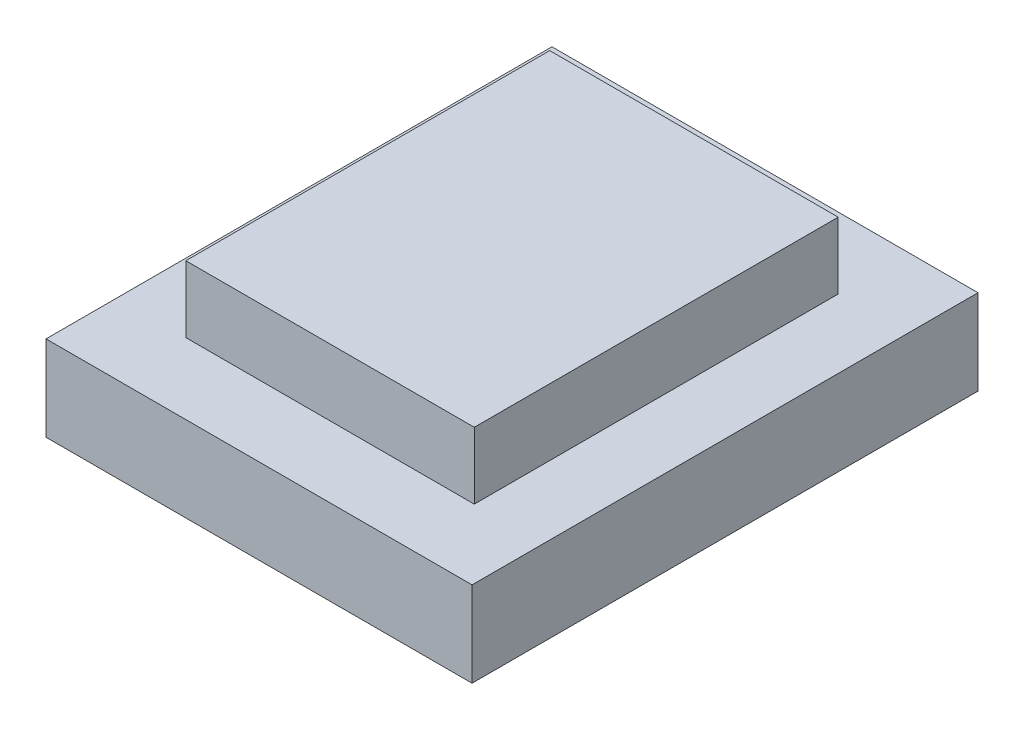
ISO-10303-21;
HEADER;
FILE_DESCRIPTION(('STEP AP214'),'2;1');
FILE_NAME('part.step','',(''),(''),'','','');
FILE_SCHEMA(('AUTOMOTIVE_DESIGN { 1 0 10303 214 1 1 1 1 }'));
ENDSEC;
DATA;
#1=APPLICATION_CONTEXT('core data for automotive mechanical design processes');
#2=APPLICATION_PROTOCOL_DEFINITION('international standard','automotive_design',2000,#1);
#3=PRODUCT_CONTEXT('',#1,'mechanical');
#4=PRODUCT('Part','Part','',(#3));
#5=PRODUCT_RELATED_PRODUCT_CATEGORY('part','',(#4));
#6=PRODUCT_DEFINITION_FORMATION('','',#4);
#7=PRODUCT_DEFINITION_CONTEXT('part definition',#1,'design');
#8=PRODUCT_DEFINITION('design','',#6,#7);
#9=PRODUCT_DEFINITION_SHAPE('','',#8);
#10=(LENGTH_UNIT() NAMED_UNIT(*) SI_UNIT(.MILLI.,.METRE.));
#11=(NAMED_UNIT(*) PLANE_ANGLE_UNIT() SI_UNIT($,.RADIAN.));
#12=(NAMED_UNIT(*) SI_UNIT($,.STERADIAN.) SOLID_ANGLE_UNIT());
#13=UNCERTAINTY_MEASURE_WITH_UNIT(LENGTH_MEASURE(1.E-05),#10,'distance_accuracy_value','');
#14=(GEOMETRIC_REPRESENTATION_CONTEXT(3) GLOBAL_UNCERTAINTY_ASSIGNED_CONTEXT((#13)) GLOBAL_UNIT_ASSIGNED_CONTEXT((#10,
#11,#12)) REPRESENTATION_CONTEXT('',''));
#15=CARTESIAN_POINT('',(0.,0.,0.));
#16=DIRECTION('',(0.,0.,1.));
#17=DIRECTION('',(1.,0.,0.));
#18=AXIS2_PLACEMENT_3D('',#15,#16,#17);
#19=CARTESIAN_POINT('',(0.,8.41,0.));
#20=DIRECTION('',(0.,1.,0.));
#21=DIRECTION('',(0.,0.,1.));
#22=AXIS2_PLACEMENT_3D('',#19,#20,#21);
#23=PLANE('',#22);
#24=DIRECTION('',(1.,0.,0.));
#25=VECTOR('',#24,1.);
#26=CARTESIAN_POINT('',(4.7,8.41,-16.7));
#27=LINE('',#26,#25);
#28=CARTESIAN_POINT('',(4.7,8.41,-16.7));
#29=VERTEX_POINT('',#28);
#30=CARTESIAN_POINT('',(14.3,8.41,-16.7));
#31=VERTEX_POINT('',#30);
#32=EDGE_CURVE('E252',#29,#31,#27,.T.);
#33=ORIENTED_EDGE('',*,*,#32,.F.);
#34=DIRECTION('',(0.,0.,1.));
#35=VECTOR('',#34,1.);
#36=CARTESIAN_POINT('',(4.7,8.41,-16.7));
#37=LINE('',#36,#35);
#38=CARTESIAN_POINT('',(4.7,8.41,-5.3));
#39=VERTEX_POINT('',#38);
#40=EDGE_CURVE('E267',#29,#39,#37,.T.);
#41=ORIENTED_EDGE('',*,*,#40,.T.);
#42=DIRECTION('',(1.,0.,0.));
#43=VECTOR('',#42,1.);
#44=CARTESIAN_POINT('',(4.7,8.41,-5.3));
#45=LINE('',#44,#43);
#46=CARTESIAN_POINT('',(14.3,8.41,-5.3));
#47=VERTEX_POINT('',#46);
#48=EDGE_CURVE('E269',#39,#47,#45,.T.);
#49=ORIENTED_EDGE('',*,*,#48,.T.);
#50=DIRECTION('',(0.,0.,1.));
#51=VECTOR('',#50,1.);
#52=CARTESIAN_POINT('',(14.3,8.41,-16.7));
#53=LINE('',#52,#51);
#54=EDGE_CURVE('E232',#31,#47,#53,.T.);
#55=ORIENTED_EDGE('',*,*,#54,.F.);
#56=EDGE_LOOP('',(#33,#41,#49,#55));
#57=FACE_BOUND('',#56,.T.);
#58=DIRECTION('',(-1.,0.,0.));
#59=VECTOR('',#58,1.);
#60=CARTESIAN_POINT('',(6.25,8.41,-15.1));
#61=LINE('',#60,#59);
#62=CARTESIAN_POINT('',(12.75,8.41,-15.1));
#63=VERTEX_POINT('',#62);
#64=CARTESIAN_POINT('',(6.25,8.41,-15.1));
#65=VERTEX_POINT('',#64);
#66=EDGE_CURVE('E201',#63,#65,#61,.T.);
#67=ORIENTED_EDGE('',*,*,#66,.F.);
#68=DIRECTION('',(0.,0.,-1.));
#69=VECTOR('',#68,1.);
#70=CARTESIAN_POINT('',(12.75,8.41,-15.1));
#71=LINE('',#70,#69);
#72=CARTESIAN_POINT('',(12.75,8.41,-6.9));
#73=VERTEX_POINT('',#72);
#74=EDGE_CURVE('E195',#73,#63,#71,.T.);
#75=ORIENTED_EDGE('',*,*,#74,.F.);
#76=DIRECTION('',(1.,0.,0.));
#77=VECTOR('',#76,1.);
#78=CARTESIAN_POINT('',(6.25,8.41,-6.9));
#79=LINE('',#78,#77);
#80=CARTESIAN_POINT('',(6.25,8.41,-6.9));
#81=VERTEX_POINT('',#80);
#82=EDGE_CURVE('E175',#81,#73,#79,.T.);
#83=ORIENTED_EDGE('',*,*,#82,.F.);
#84=DIRECTION('',(0.,0.,1.));
#85=VECTOR('',#84,1.);
#86=CARTESIAN_POINT('',(6.25,8.41,-15.1));
#87=LINE('',#86,#85);
#88=EDGE_CURVE('E71',#65,#81,#87,.T.);
#89=ORIENTED_EDGE('',*,*,#88,.F.);
#90=EDGE_LOOP('',(#67,#75,#83,#89));
#91=FACE_BOUND('',#90,.T.);
#92=ADVANCED_FACE('F57',(#57,#91),#23,.T.);
#93=CARTESIAN_POINT('',(4.7,23.3136908180491,-16.7));
#94=DIRECTION('',(0.,0.,-1.));
#95=DIRECTION('',(-1.,0.,0.));
#96=AXIS2_PLACEMENT_3D('',#93,#94,#95);
#97=PLANE('',#96);
#98=DIRECTION('',(1.,0.,0.));
#99=VECTOR('',#98,1.);
#100=CARTESIAN_POINT('',(4.7,6.79,-16.7));
#101=LINE('',#100,#99);
#102=CARTESIAN_POINT('',(8.00000000000001,6.79,-16.7));
#103=VERTEX_POINT('',#102);
#104=CARTESIAN_POINT('',(11.,6.79,-16.7));
#105=VERTEX_POINT('',#104);
#106=EDGE_CURVE('E218',#103,#105,#101,.T.);
#107=ORIENTED_EDGE('',*,*,#106,.F.);
#108=DIRECTION('',(0.,-1.,0.));
#109=VECTOR('',#108,1.);
#110=CARTESIAN_POINT('',(8.,23.3136908180491,-16.7));
#111=LINE('',#110,#109);
#112=CARTESIAN_POINT('',(8.00000000000001,6.49,-16.7));
#113=VERTEX_POINT('',#112);
#114=EDGE_CURVE('E215',#103,#113,#111,.T.);
#115=ORIENTED_EDGE('',*,*,#114,.T.);
#116=DIRECTION('',(1.,0.,0.));
#117=VECTOR('',#116,1.);
#118=CARTESIAN_POINT('',(4.7,6.49,-16.7));
#119=LINE('',#118,#117);
#120=CARTESIAN_POINT('',(4.7,6.49,-16.7));
#121=VERTEX_POINT('',#120);
#122=EDGE_CURVE('E221',#121,#113,#119,.T.);
#123=ORIENTED_EDGE('',*,*,#122,.F.);
#124=DIRECTION('',(0.,-1.,0.));
#125=VECTOR('',#124,1.);
#126=CARTESIAN_POINT('',(4.7,23.3136908180491,-16.7));
#127=LINE('',#126,#125);
#128=EDGE_CURVE('E220',#29,#121,#127,.T.);
#129=ORIENTED_EDGE('',*,*,#128,.F.);
#130=ORIENTED_EDGE('',*,*,#32,.T.);
#131=DIRECTION('',(0.,-1.,0.));
#132=VECTOR('',#131,1.);
#133=CARTESIAN_POINT('',(14.3,23.3136908180491,-16.7));
#134=LINE('',#133,#132);
#135=CARTESIAN_POINT('',(14.3,6.49,-16.7));
#136=VERTEX_POINT('',#135);
#137=EDGE_CURVE('E255',#31,#136,#134,.T.);
#138=ORIENTED_EDGE('',*,*,#137,.T.);
#139=CARTESIAN_POINT('',(11.,6.49,-16.7));
#140=VERTEX_POINT('',#139);
#141=EDGE_CURVE('E225',#140,#136,#119,.T.);
#142=ORIENTED_EDGE('',*,*,#141,.F.);
#143=DIRECTION('',(0.,-1.,0.));
#144=VECTOR('',#143,1.);
#145=CARTESIAN_POINT('',(11.,23.3136908180491,-16.7));
#146=LINE('',#145,#144);
#147=EDGE_CURVE('E79',#105,#140,#146,.T.);
#148=ORIENTED_EDGE('',*,*,#147,.F.);
#149=EDGE_LOOP('',(#107,#115,#123,#129,#130,#138,#142,#148));
#150=FACE_BOUND('',#149,.T.);
#151=ADVANCED_FACE('F293',(#150),#97,.T.);
#152=CARTESIAN_POINT('',(7.7,23.3136908180491,-13.7));
#153=DIRECTION('',(0.,0.,-1.));
#154=DIRECTION('',(-1.,0.,0.));
#155=AXIS2_PLACEMENT_3D('',#152,#153,#154);
#156=PLANE('',#155);
#157=DIRECTION('',(0.,-1.,0.));
#158=VECTOR('',#157,1.);
#159=CARTESIAN_POINT('',(8.00000000000001,6.79,-13.7));
#160=LINE('',#159,#158);
#161=CARTESIAN_POINT('',(8.00000000000001,6.79,-13.7));
#162=VERTEX_POINT('',#161);
#163=CARTESIAN_POINT('',(8.00000000000001,6.49,-13.7));
#164=VERTEX_POINT('',#163);
#165=EDGE_CURVE('E212',#162,#164,#160,.T.);
#166=ORIENTED_EDGE('',*,*,#165,.F.);
#167=DIRECTION('',(-1.,0.,0.));
#168=VECTOR('',#167,1.);
#169=CARTESIAN_POINT('',(11.,6.79,-13.7));
#170=LINE('',#169,#168);
#171=CARTESIAN_POINT('',(11.,6.79,-13.7));
#172=VERTEX_POINT('',#171);
#173=EDGE_CURVE('E191',#172,#162,#170,.T.);
#174=ORIENTED_EDGE('',*,*,#173,.F.);
#175=DIRECTION('',(0.,-1.,0.));
#176=VECTOR('',#175,1.);
#177=CARTESIAN_POINT('',(11.,6.79,-13.7));
#178=LINE('',#177,#176);
#179=CARTESIAN_POINT('',(11.,6.49,-13.7));
#180=VERTEX_POINT('',#179);
#181=EDGE_CURVE('E209',#172,#180,#178,.T.);
#182=ORIENTED_EDGE('',*,*,#181,.T.);
#183=DIRECTION('',(1.,0.,0.));
#184=VECTOR('',#183,1.);
#185=CARTESIAN_POINT('',(7.7,6.49,-13.7));
#186=LINE('',#185,#184);
#187=CARTESIAN_POINT('',(11.3,6.49,-13.7));
#188=VERTEX_POINT('',#187);
#189=EDGE_CURVE('E240',#180,#188,#186,.T.);
#190=ORIENTED_EDGE('',*,*,#189,.T.);
#191=DIRECTION('',(0.,-1.,0.));
#192=VECTOR('',#191,1.);
#193=CARTESIAN_POINT('',(11.3,23.3136908180491,-13.7));
#194=LINE('',#193,#192);
#195=CARTESIAN_POINT('',(11.3,8.41,-13.7));
#196=VERTEX_POINT('',#195);
#197=EDGE_CURVE('E245',#196,#188,#194,.T.);
#198=ORIENTED_EDGE('',*,*,#197,.F.);
#199=DIRECTION('',(1.,0.,0.));
#200=VECTOR('',#199,1.);
#201=CARTESIAN_POINT('',(7.7,8.41,-13.7));
#202=LINE('',#201,#200);
#203=CARTESIAN_POINT('',(7.7,8.41,-13.7));
#204=VERTEX_POINT('',#203);
#205=EDGE_CURVE('E249',#204,#196,#202,.T.);
#206=ORIENTED_EDGE('',*,*,#205,.F.);
#207=DIRECTION('',(0.,-1.,0.));
#208=VECTOR('',#207,1.);
#209=CARTESIAN_POINT('',(7.7,23.3136908180491,-13.7));
#210=LINE('',#209,#208);
#211=CARTESIAN_POINT('',(7.7,6.49,-13.7));
#212=VERTEX_POINT('',#211);
#213=EDGE_CURVE('E244',#204,#212,#210,.T.);
#214=ORIENTED_EDGE('',*,*,#213,.T.);
#215=EDGE_CURVE('E237',#212,#164,#186,.T.);
#216=ORIENTED_EDGE('',*,*,#215,.T.);
#217=EDGE_LOOP('',(#166,#174,#182,#190,#198,#206,#214,#216));
#218=FACE_BOUND('',#217,.T.);
#219=ADVANCED_FACE('F313',(#218),#156,.F.);
#220=CARTESIAN_POINT('',(0.,6.49,0.));
#221=DIRECTION('',(0.,1.,0.));
#222=DIRECTION('',(0.,0.,1.));
#223=AXIS2_PLACEMENT_3D('',#220,#221,#222);
#224=PLANE('',#223);
#225=DIRECTION('',(0.,0.,-1.));
#226=VECTOR('',#225,1.);
#227=CARTESIAN_POINT('',(8.00000000000001,6.49,0.));
#228=LINE('',#227,#226);
#229=EDGE_CURVE('E12',#164,#113,#228,.T.);
#230=ORIENTED_EDGE('',*,*,#229,.F.);
#231=ORIENTED_EDGE('',*,*,#215,.F.);
#232=DIRECTION('',(0.,0.,1.));
#233=VECTOR('',#232,1.);
#234=CARTESIAN_POINT('',(7.7,6.49,-13.7));
#235=LINE('',#234,#233);
#236=CARTESIAN_POINT('',(7.7,6.49,-8.3));
#237=VERTEX_POINT('',#236);
#238=EDGE_CURVE('E228',#212,#237,#235,.T.);
#239=ORIENTED_EDGE('',*,*,#238,.T.);
#240=DIRECTION('',(1.,0.,0.));
#241=VECTOR('',#240,1.);
#242=CARTESIAN_POINT('',(7.7,6.49,-8.3));
#243=LINE('',#242,#241);
#244=CARTESIAN_POINT('',(11.3,6.49,-8.3));
#245=VERTEX_POINT('',#244);
#246=EDGE_CURVE('E246',#237,#245,#243,.T.);
#247=ORIENTED_EDGE('',*,*,#246,.T.);
#248=DIRECTION('',(0.,0.,1.));
#249=VECTOR('',#248,1.);
#250=CARTESIAN_POINT('',(11.3,6.49,-13.7));
#251=LINE('',#250,#249);
#252=EDGE_CURVE('E241',#188,#245,#251,.T.);
#253=ORIENTED_EDGE('',*,*,#252,.F.);
#254=ORIENTED_EDGE('',*,*,#189,.F.);
#255=DIRECTION('',(0.,0.,-1.));
#256=VECTOR('',#255,1.);
#257=CARTESIAN_POINT('',(11.,6.49,0.));
#258=LINE('',#257,#256);
#259=EDGE_CURVE('E64',#180,#140,#258,.T.);
#260=ORIENTED_EDGE('',*,*,#259,.T.);
#261=ORIENTED_EDGE('',*,*,#141,.T.);
#262=DIRECTION('',(0.,0.,1.));
#263=VECTOR('',#262,1.);
#264=CARTESIAN_POINT('',(14.3,6.49,-16.7));
#265=LINE('',#264,#263);
#266=CARTESIAN_POINT('',(14.3,6.49,-5.3));
#267=VERTEX_POINT('',#266);
#268=EDGE_CURVE('E224',#136,#267,#265,.T.);
#269=ORIENTED_EDGE('',*,*,#268,.T.);
#270=DIRECTION('',(1.,0.,0.));
#271=VECTOR('',#270,1.);
#272=CARTESIAN_POINT('',(4.7,6.49,-5.3));
#273=LINE('',#272,#271);
#274=CARTESIAN_POINT('',(4.7,6.49,-5.3));
#275=VERTEX_POINT('',#274);
#276=EDGE_CURVE('E229',#275,#267,#273,.T.);
#277=ORIENTED_EDGE('',*,*,#276,.F.);
#278=DIRECTION('',(0.,0.,1.));
#279=VECTOR('',#278,1.);
#280=CARTESIAN_POINT('',(4.7,6.49,-16.7));
#281=LINE('',#280,#279);
#282=EDGE_CURVE('E234',#121,#275,#281,.T.);
#283=ORIENTED_EDGE('',*,*,#282,.F.);
#284=ORIENTED_EDGE('',*,*,#122,.T.);
#285=EDGE_LOOP('',(#230,#231,#239,#247,#253,#254,#260,#261,#269,#277,#283,#284));
#286=FACE_BOUND('',#285,.T.);
#287=ADVANCED_FACE('F288',(#286),#224,.F.);
#288=CARTESIAN_POINT('',(4.7,23.3136908180491,-16.7));
#289=DIRECTION('',(1.,0.,0.));
#290=DIRECTION('',(0.,0.,-1.));
#291=AXIS2_PLACEMENT_3D('',#288,#289,#290);
#292=PLANE('',#291);
#293=ORIENTED_EDGE('',*,*,#40,.F.);
#294=ORIENTED_EDGE('',*,*,#128,.T.);
#295=ORIENTED_EDGE('',*,*,#282,.T.);
#296=DIRECTION('',(0.,-1.,0.));
#297=VECTOR('',#296,1.);
#298=CARTESIAN_POINT('',(4.7,23.3136908180491,-5.3));
#299=LINE('',#298,#297);
#300=EDGE_CURVE('E233',#39,#275,#299,.T.);
#301=ORIENTED_EDGE('',*,*,#300,.F.);
#302=EDGE_LOOP('',(#293,#294,#295,#301));
#303=FACE_BOUND('',#302,.T.);
#304=ADVANCED_FACE('F307',(#303),#292,.F.);
#305=CARTESIAN_POINT('',(4.7,23.3136908180491,-5.3));
#306=DIRECTION('',(0.,0.,-1.));
#307=DIRECTION('',(-1.,0.,0.));
#308=AXIS2_PLACEMENT_3D('',#305,#306,#307);
#309=PLANE('',#308);
#310=ORIENTED_EDGE('',*,*,#48,.F.);
#311=ORIENTED_EDGE('',*,*,#300,.T.);
#312=ORIENTED_EDGE('',*,*,#276,.T.);
#313=DIRECTION('',(0.,-1.,0.));
#314=VECTOR('',#313,1.);
#315=CARTESIAN_POINT('',(14.3,23.3136908180491,-5.3));
#316=LINE('',#315,#314);
#317=EDGE_CURVE('E256',#47,#267,#316,.T.);
#318=ORIENTED_EDGE('',*,*,#317,.F.);
#319=EDGE_LOOP('',(#310,#311,#312,#318));
#320=FACE_BOUND('',#319,.T.);
#321=ADVANCED_FACE('F474',(#320),#309,.F.);
#322=CARTESIAN_POINT('',(14.3,23.3136908180491,-16.7));
#323=DIRECTION('',(1.,0.,0.));
#324=DIRECTION('',(0.,0.,-1.));
#325=AXIS2_PLACEMENT_3D('',#322,#323,#324);
#326=PLANE('',#325);
#327=ORIENTED_EDGE('',*,*,#137,.F.);
#328=ORIENTED_EDGE('',*,*,#54,.T.);
#329=ORIENTED_EDGE('',*,*,#317,.T.);
#330=ORIENTED_EDGE('',*,*,#268,.F.);
#331=EDGE_LOOP('',(#327,#328,#329,#330));
#332=FACE_BOUND('',#331,.T.);
#333=ADVANCED_FACE('F298',(#332),#326,.T.);
#334=CARTESIAN_POINT('',(7.7,23.3136908180491,-13.7));
#335=DIRECTION('',(1.,0.,0.));
#336=DIRECTION('',(0.,0.,-1.));
#337=AXIS2_PLACEMENT_3D('',#334,#335,#336);
#338=PLANE('',#337);
#339=ORIENTED_EDGE('',*,*,#213,.F.);
#340=DIRECTION('',(0.,0.,1.));
#341=VECTOR('',#340,1.);
#342=CARTESIAN_POINT('',(7.7,8.41,-13.7));
#343=LINE('',#342,#341);
#344=CARTESIAN_POINT('',(7.7,8.41,-8.3));
#345=VERTEX_POINT('',#344);
#346=EDGE_CURVE('E257',#204,#345,#343,.T.);
#347=ORIENTED_EDGE('',*,*,#346,.T.);
#348=DIRECTION('',(0.,-1.,0.));
#349=VECTOR('',#348,1.);
#350=CARTESIAN_POINT('',(7.7,23.3136908180491,-8.3));
#351=LINE('',#350,#349);
#352=EDGE_CURVE('E259',#345,#237,#351,.T.);
#353=ORIENTED_EDGE('',*,*,#352,.T.);
#354=ORIENTED_EDGE('',*,*,#238,.F.);
#355=EDGE_LOOP('',(#339,#347,#353,#354));
#356=FACE_BOUND('',#355,.T.);
#357=ADVANCED_FACE('F319',(#356),#338,.T.);
#358=CARTESIAN_POINT('',(7.7,23.3136908180491,-8.3));
#359=DIRECTION('',(0.,0.,-1.));
#360=DIRECTION('',(-1.,0.,0.));
#361=AXIS2_PLACEMENT_3D('',#358,#359,#360);
#362=PLANE('',#361);
#363=ORIENTED_EDGE('',*,*,#352,.F.);
#364=DIRECTION('',(1.,0.,0.));
#365=VECTOR('',#364,1.);
#366=CARTESIAN_POINT('',(7.7,8.41,-8.3));
#367=LINE('',#366,#365);
#368=CARTESIAN_POINT('',(11.3,8.41,-8.3));
#369=VERTEX_POINT('',#368);
#370=EDGE_CURVE('E260',#345,#369,#367,.T.);
#371=ORIENTED_EDGE('',*,*,#370,.T.);
#372=DIRECTION('',(0.,-1.,0.));
#373=VECTOR('',#372,1.);
#374=CARTESIAN_POINT('',(11.3,23.3136908180491,-8.3));
#375=LINE('',#374,#373);
#376=EDGE_CURVE('E263',#369,#245,#375,.T.);
#377=ORIENTED_EDGE('',*,*,#376,.T.);
#378=ORIENTED_EDGE('',*,*,#246,.F.);
#379=EDGE_LOOP('',(#363,#371,#377,#378));
#380=FACE_BOUND('',#379,.T.);
#381=ADVANCED_FACE('F323',(#380),#362,.T.);
#382=CARTESIAN_POINT('',(11.3,23.3136908180491,-13.7));
#383=DIRECTION('',(1.,0.,0.));
#384=DIRECTION('',(0.,0.,-1.));
#385=AXIS2_PLACEMENT_3D('',#382,#383,#384);
#386=PLANE('',#385);
#387=DIRECTION('',(0.,0.,1.));
#388=VECTOR('',#387,1.);
#389=CARTESIAN_POINT('',(11.3,8.41,-13.7));
#390=LINE('',#389,#388);
#391=EDGE_CURVE('E264',#196,#369,#390,.T.);
#392=ORIENTED_EDGE('',*,*,#391,.F.);
#393=ORIENTED_EDGE('',*,*,#197,.T.);
#394=ORIENTED_EDGE('',*,*,#252,.T.);
#395=ORIENTED_EDGE('',*,*,#376,.F.);
#396=EDGE_LOOP('',(#392,#393,#394,#395));
#397=FACE_BOUND('',#396,.T.);
#398=ADVANCED_FACE('F327',(#397),#386,.F.);
#399=CARTESIAN_POINT('',(8.,6.79,-32.3));
#400=DIRECTION('',(1.,0.,0.));
#401=DIRECTION('',(0.,0.,-1.));
#402=AXIS2_PLACEMENT_3D('',#399,#400,#401);
#403=PLANE('',#402);
#404=DIRECTION('',(0.,0.,1.));
#405=VECTOR('',#404,1.);
#406=CARTESIAN_POINT('',(8.,6.79,-32.3));
#407=LINE('',#406,#405);
#408=EDGE_CURVE('E189',#103,#162,#407,.T.);
#409=ORIENTED_EDGE('',*,*,#408,.T.);
#410=ORIENTED_EDGE('',*,*,#165,.T.);
#411=ORIENTED_EDGE('',*,*,#229,.T.);
#412=ORIENTED_EDGE('',*,*,#114,.F.);
#413=EDGE_LOOP('',(#409,#410,#411,#412));
#414=FACE_BOUND('',#413,.T.);
#415=ADVANCED_FACE('F332',(#414),#403,.T.);
#416=CARTESIAN_POINT('',(11.,6.79,-32.3));
#417=DIRECTION('',(1.,0.,0.));
#418=DIRECTION('',(0.,0.,-1.));
#419=AXIS2_PLACEMENT_3D('',#416,#417,#418);
#420=PLANE('',#419);
#421=ORIENTED_EDGE('',*,*,#147,.T.);
#422=ORIENTED_EDGE('',*,*,#259,.F.);
#423=ORIENTED_EDGE('',*,*,#181,.F.);
#424=DIRECTION('',(0.,0.,1.));
#425=VECTOR('',#424,1.);
#426=CARTESIAN_POINT('',(11.,6.79,-32.3));
#427=LINE('',#426,#425);
#428=EDGE_CURVE('E207',#105,#172,#427,.T.);
#429=ORIENTED_EDGE('',*,*,#428,.F.);
#430=EDGE_LOOP('',(#421,#422,#423,#429));
#431=FACE_BOUND('',#430,.T.);
#432=ADVANCED_FACE('F328',(#431),#420,.F.);
#433=CARTESIAN_POINT('',(0.,6.79,0.));
#434=DIRECTION('',(0.,1.,0.));
#435=DIRECTION('',(0.,0.,1.));
#436=AXIS2_PLACEMENT_3D('',#433,#434,#435);
#437=PLANE('',#436);
#438=ORIENTED_EDGE('',*,*,#106,.T.);
#439=ORIENTED_EDGE('',*,*,#428,.T.);
#440=ORIENTED_EDGE('',*,*,#173,.T.);
#441=ORIENTED_EDGE('',*,*,#408,.F.);
#442=EDGE_LOOP('',(#438,#439,#440,#441));
#443=FACE_BOUND('',#442,.T.);
#444=ADVANCED_FACE('F330',(#443),#437,.F.);
#445=CARTESIAN_POINT('',(0.,9.91,0.));
#446=DIRECTION('',(0.,1.,0.));
#447=DIRECTION('',(0.,0.,1.));
#448=AXIS2_PLACEMENT_3D('',#445,#446,#447);
#449=PLANE('',#448);
#450=DIRECTION('',(1.,0.,0.));
#451=VECTOR('',#450,1.);
#452=CARTESIAN_POINT('',(6.25,9.91,-6.9));
#453=LINE('',#452,#451);
#454=CARTESIAN_POINT('',(6.25,9.91,-6.9));
#455=VERTEX_POINT('',#454);
#456=CARTESIAN_POINT('',(12.75,9.91,-6.9));
#457=VERTEX_POINT('',#456);
#458=EDGE_CURVE('E178',#455,#457,#453,.T.);
#459=ORIENTED_EDGE('',*,*,#458,.T.);
#460=DIRECTION('',(0.,0.,-1.));
#461=VECTOR('',#460,1.);
#462=CARTESIAN_POINT('',(12.75,9.91,-15.1));
#463=LINE('',#462,#461);
#464=CARTESIAN_POINT('',(12.75,9.91,-15.1));
#465=VERTEX_POINT('',#464);
#466=EDGE_CURVE('E184',#457,#465,#463,.T.);
#467=ORIENTED_EDGE('',*,*,#466,.T.);
#468=DIRECTION('',(-1.,0.,0.));
#469=VECTOR('',#468,1.);
#470=CARTESIAN_POINT('',(6.25,9.91,-15.1));
#471=LINE('',#470,#469);
#472=CARTESIAN_POINT('',(6.25,9.91,-15.1));
#473=VERTEX_POINT('',#472);
#474=EDGE_CURVE('E188',#465,#473,#471,.T.);
#475=ORIENTED_EDGE('',*,*,#474,.T.);
#476=DIRECTION('',(0.,0.,1.));
#477=VECTOR('',#476,1.);
#478=CARTESIAN_POINT('',(6.25,9.91,-15.1));
#479=LINE('',#478,#477);
#480=EDGE_CURVE('E170',#473,#455,#479,.T.);
#481=ORIENTED_EDGE('',*,*,#480,.T.);
#482=EDGE_LOOP('',(#459,#467,#475,#481));
#483=FACE_BOUND('',#482,.T.);
#484=ADVANCED_FACE('F187',(#483),#449,.T.);
#485=CARTESIAN_POINT('',(6.25,20.373746938836,-6.9));
#486=DIRECTION('',(0.,0.,-1.));
#487=DIRECTION('',(-1.,0.,0.));
#488=AXIS2_PLACEMENT_3D('',#485,#486,#487);
#489=PLANE('',#488);
#490=ORIENTED_EDGE('',*,*,#458,.F.);
#491=DIRECTION('',(0.,-1.,0.));
#492=VECTOR('',#491,1.);
#493=CARTESIAN_POINT('',(6.25,20.373746938836,-6.9));
#494=LINE('',#493,#492);
#495=EDGE_CURVE('E166',#455,#81,#494,.T.);
#496=ORIENTED_EDGE('',*,*,#495,.T.);
#497=ORIENTED_EDGE('',*,*,#82,.T.);
#498=DIRECTION('',(0.,-1.,0.));
#499=VECTOR('',#498,1.);
#500=CARTESIAN_POINT('',(12.75,20.373746938836,-6.9));
#501=LINE('',#500,#499);
#502=EDGE_CURVE('E180',#457,#73,#501,.T.);
#503=ORIENTED_EDGE('',*,*,#502,.F.);
#504=EDGE_LOOP('',(#490,#496,#497,#503));
#505=FACE_BOUND('',#504,.T.);
#506=ADVANCED_FACE('F179',(#505),#489,.F.);
#507=CARTESIAN_POINT('',(6.25,20.373746938836,-15.1));
#508=DIRECTION('',(1.,0.,0.));
#509=DIRECTION('',(0.,0.,-1.));
#510=AXIS2_PLACEMENT_3D('',#507,#508,#509);
#511=PLANE('',#510);
#512=ORIENTED_EDGE('',*,*,#480,.F.);
#513=DIRECTION('',(0.,-1.,0.));
#514=VECTOR('',#513,1.);
#515=CARTESIAN_POINT('',(6.25,20.373746938836,-15.1));
#516=LINE('',#515,#514);
#517=EDGE_CURVE('E202',#473,#65,#516,.T.);
#518=ORIENTED_EDGE('',*,*,#517,.T.);
#519=ORIENTED_EDGE('',*,*,#88,.T.);
#520=ORIENTED_EDGE('',*,*,#495,.F.);
#521=EDGE_LOOP('',(#512,#518,#519,#520));
#522=FACE_BOUND('',#521,.T.);
#523=ADVANCED_FACE('F168',(#522),#511,.F.);
#524=CARTESIAN_POINT('',(6.25,20.373746938836,-15.1));
#525=DIRECTION('',(0.,0.,1.));
#526=DIRECTION('',(1.,0.,0.));
#527=AXIS2_PLACEMENT_3D('',#524,#525,#526);
#528=PLANE('',#527);
#529=ORIENTED_EDGE('',*,*,#474,.F.);
#530=DIRECTION('',(0.,-1.,0.));
#531=VECTOR('',#530,1.);
#532=CARTESIAN_POINT('',(12.75,20.373746938836,-15.1));
#533=LINE('',#532,#531);
#534=EDGE_CURVE('E199',#465,#63,#533,.T.);
#535=ORIENTED_EDGE('',*,*,#534,.T.);
#536=ORIENTED_EDGE('',*,*,#66,.T.);
#537=ORIENTED_EDGE('',*,*,#517,.F.);
#538=EDGE_LOOP('',(#529,#535,#536,#537));
#539=FACE_BOUND('',#538,.T.);
#540=ADVANCED_FACE('F356',(#539),#528,.F.);
#541=CARTESIAN_POINT('',(12.75,20.373746938836,-15.1));
#542=DIRECTION('',(-1.,0.,0.));
#543=DIRECTION('',(0.,0.,1.));
#544=AXIS2_PLACEMENT_3D('',#541,#542,#543);
#545=PLANE('',#544);
#546=ORIENTED_EDGE('',*,*,#466,.F.);
#547=ORIENTED_EDGE('',*,*,#502,.T.);
#548=ORIENTED_EDGE('',*,*,#74,.T.);
#549=ORIENTED_EDGE('',*,*,#534,.F.);
#550=EDGE_LOOP('',(#546,#547,#548,#549));
#551=FACE_BOUND('',#550,.T.);
#552=ADVANCED_FACE('F359',(#551),#545,.F.);
#553=CARTESIAN_POINT('',(0.,8.41,0.));
#554=DIRECTION('',(0.,1.,0.));
#555=DIRECTION('',(0.,0.,1.));
#556=AXIS2_PLACEMENT_3D('',#553,#554,#555);
#557=PLANE('',#556);
#558=ORIENTED_EDGE('',*,*,#346,.F.);
#559=ORIENTED_EDGE('',*,*,#205,.T.);
#560=ORIENTED_EDGE('',*,*,#391,.T.);
#561=ORIENTED_EDGE('',*,*,#370,.F.);
#562=EDGE_LOOP('',(#558,#559,#560,#561));
#563=FACE_BOUND('',#562,.T.);
#564=ADVANCED_FACE('F361',(#563),#557,.F.);
#565=CLOSED_SHELL('',(#92,#151,#219,#287,#304,#321,#333,#357,#381,#398,#415,#432,#444,#484,#506,
#523,#540,#552,#564));
#566=MANIFOLD_SOLID_BREP('B2',#565);
#567=ADVANCED_BREP_SHAPE_REPRESENTATION('',(#18,#566),#14);
#568=SHAPE_DEFINITION_REPRESENTATION(#9,#567);
ENDSEC;
END-ISO-10303-21;
